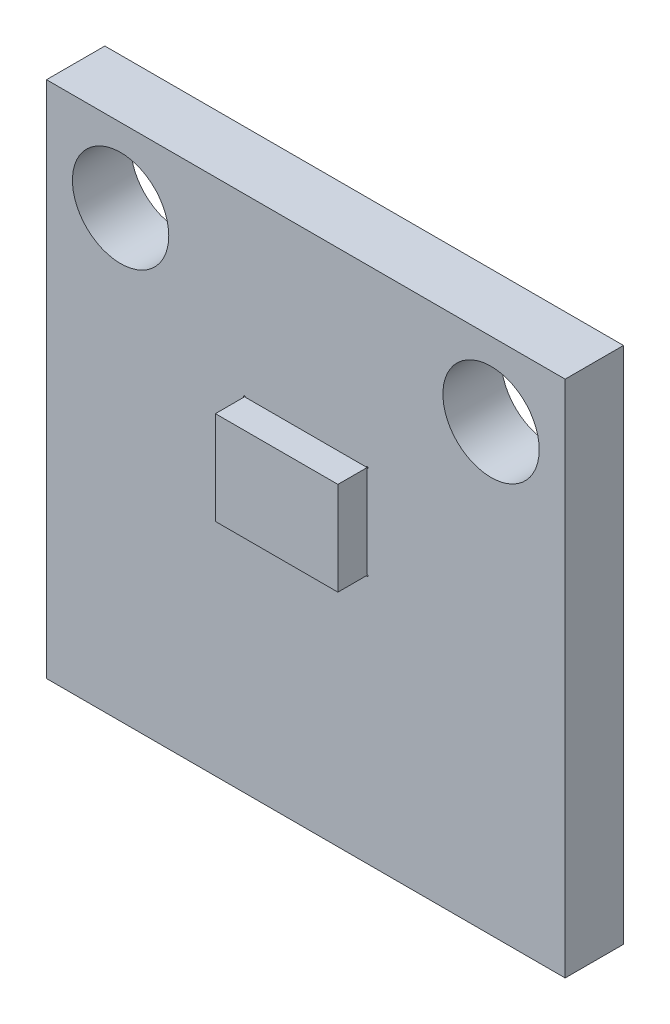
ISO-10303-21;
HEADER;
FILE_DESCRIPTION(('STEP AP214'),'2;1');
FILE_NAME('part.step','',(''),(''),'','','');
FILE_SCHEMA(('AUTOMOTIVE_DESIGN { 1 0 10303 214 1 1 1 1 }'));
ENDSEC;
DATA;
#1=APPLICATION_CONTEXT('core data for automotive mechanical design processes');
#2=APPLICATION_PROTOCOL_DEFINITION('international standard','automotive_design',2000,#1);
#3=PRODUCT_CONTEXT('',#1,'mechanical');
#4=PRODUCT('Part','Part','',(#3));
#5=PRODUCT_RELATED_PRODUCT_CATEGORY('part','',(#4));
#6=PRODUCT_DEFINITION_FORMATION('','',#4);
#7=PRODUCT_DEFINITION_CONTEXT('part definition',#1,'design');
#8=PRODUCT_DEFINITION('design','',#6,#7);
#9=PRODUCT_DEFINITION_SHAPE('','',#8);
#10=(LENGTH_UNIT() NAMED_UNIT(*) SI_UNIT(.MILLI.,.METRE.));
#11=(NAMED_UNIT(*) PLANE_ANGLE_UNIT() SI_UNIT($,.RADIAN.));
#12=(NAMED_UNIT(*) SI_UNIT($,.STERADIAN.) SOLID_ANGLE_UNIT());
#13=UNCERTAINTY_MEASURE_WITH_UNIT(LENGTH_MEASURE(1.E-05),#10,'distance_accuracy_value','');
#14=(GEOMETRIC_REPRESENTATION_CONTEXT(3) GLOBAL_UNCERTAINTY_ASSIGNED_CONTEXT((#13)) GLOBAL_UNIT_ASSIGNED_CONTEXT((#10,
#11,#12)) REPRESENTATION_CONTEXT('',''));
#15=CARTESIAN_POINT('',(0.,0.,0.));
#16=DIRECTION('',(0.,0.,1.));
#17=DIRECTION('',(1.,0.,0.));
#18=AXIS2_PLACEMENT_3D('',#15,#16,#17);
#19=CARTESIAN_POINT('',(0.,0.,2.));
#20=DIRECTION('',(0.,0.,1.));
#21=DIRECTION('',(1.,0.,0.));
#22=AXIS2_PLACEMENT_3D('',#19,#20,#21);
#23=PLANE('',#22);
#24=CARTESIAN_POINT('',(15.24,15.24,2.));
#25=DIRECTION('',(0.,0.,1.));
#26=DIRECTION('',(1.,0.,0.));
#27=AXIS2_PLACEMENT_3D('',#24,#25,#26);
#28=CIRCLE('',#27,1.651);
#29=CARTESIAN_POINT('',(16.891,15.24,2.));
#30=VERTEX_POINT('',#29);
#31=EDGE_CURVE('E308',#30,#30,#28,.T.);
#32=ORIENTED_EDGE('',*,*,#31,.F.);
#33=EDGE_LOOP('',(#32));
#34=FACE_BOUND('',#33,.T.);
#35=CARTESIAN_POINT('',(2.54,15.24,2.));
#36=DIRECTION('',(0.,0.,1.));
#37=DIRECTION('',(1.,0.,0.));
#38=AXIS2_PLACEMENT_3D('',#35,#36,#37);
#39=CIRCLE('',#38,1.651);
#40=CARTESIAN_POINT('',(4.191,15.24,2.));
#41=VERTEX_POINT('',#40);
#42=EDGE_CURVE('E302',#41,#41,#39,.T.);
#43=ORIENTED_EDGE('',*,*,#42,.F.);
#44=EDGE_LOOP('',(#43));
#45=FACE_BOUND('',#44,.T.);
#46=DIRECTION('',(-1.,0.,0.));
#47=VECTOR('',#46,1.);
#48=CARTESIAN_POINT('',(0.,0.,2.));
#49=LINE('',#48,#47);
#50=CARTESIAN_POINT('',(17.78,0.,2.));
#51=VERTEX_POINT('',#50);
#52=CARTESIAN_POINT('',(0.,0.,2.));
#53=VERTEX_POINT('',#52);
#54=EDGE_CURVE('E160',#51,#53,#49,.T.);
#55=ORIENTED_EDGE('',*,*,#54,.F.);
#56=DIRECTION('',(0.,-1.,0.));
#57=VECTOR('',#56,1.);
#58=CARTESIAN_POINT('',(17.78,0.,2.));
#59=LINE('',#58,#57);
#60=CARTESIAN_POINT('',(17.78,17.78,2.));
#61=VERTEX_POINT('',#60);
#62=EDGE_CURVE('E147',#61,#51,#59,.T.);
#63=ORIENTED_EDGE('',*,*,#62,.F.);
#64=DIRECTION('',(1.,0.,0.));
#65=VECTOR('',#64,1.);
#66=CARTESIAN_POINT('',(0.,17.78,2.));
#67=LINE('',#66,#65);
#68=CARTESIAN_POINT('',(0.,17.78,2.));
#69=VERTEX_POINT('',#68);
#70=EDGE_CURVE('E159',#69,#61,#67,.T.);
#71=ORIENTED_EDGE('',*,*,#70,.F.);
#72=DIRECTION('',(0.,1.,0.));
#73=VECTOR('',#72,1.);
#74=CARTESIAN_POINT('',(0.,0.,2.));
#75=LINE('',#74,#73);
#76=EDGE_CURVE('E163',#53,#69,#75,.T.);
#77=ORIENTED_EDGE('',*,*,#76,.F.);
#78=EDGE_LOOP('',(#55,#63,#71,#77));
#79=FACE_BOUND('',#78,.T.);
#80=CARTESIAN_POINT('',(10.9899958,8.5600032,2.));
#81=DIRECTION('',(0.,0.,1.));
#82=DIRECTION('',(1.,0.,0.));
#83=AXIS2_PLACEMENT_3D('',#80,#81,#82);
#84=CIRCLE('',#83,0.0317499999999997);
#85=CARTESIAN_POINT('',(10.9582458,8.5600032,2.));
#86=VERTEX_POINT('',#85);
#87=CARTESIAN_POINT('',(10.9899958,8.5917532,2.));
#88=VERTEX_POINT('',#87);
#89=EDGE_CURVE('E211',#86,#88,#84,.T.);
#90=ORIENTED_EDGE('',*,*,#89,.F.);
#91=DIRECTION('',(-1.,0.,0.));
#92=VECTOR('',#91,1.);
#93=CARTESIAN_POINT('',(0.,8.5600032,2.));
#94=LINE('',#93,#92);
#95=CARTESIAN_POINT('',(6.8217542,8.5600032,2.));
#96=VERTEX_POINT('',#95);
#97=EDGE_CURVE('E173',#86,#96,#94,.T.);
#98=ORIENTED_EDGE('',*,*,#97,.T.);
#99=CARTESIAN_POINT('',(6.7900042,8.5600032,2.));
#100=DIRECTION('',(0.,0.,1.));
#101=DIRECTION('',(1.,0.,0.));
#102=AXIS2_PLACEMENT_3D('',#99,#100,#101);
#103=CIRCLE('',#102,0.0317500000000001);
#104=CARTESIAN_POINT('',(6.7900042,8.5917532,2.));
#105=VERTEX_POINT('',#104);
#106=EDGE_CURVE('E319',#105,#96,#103,.T.);
#107=ORIENTED_EDGE('',*,*,#106,.F.);
#108=DIRECTION('',(0.,1.,0.));
#109=VECTOR('',#108,1.);
#110=CARTESIAN_POINT('',(6.7900042,0.,2.));
#111=LINE('',#110,#109);
#112=CARTESIAN_POINT('',(6.7900042,11.7282468,2.));
#113=VERTEX_POINT('',#112);
#114=EDGE_CURVE('E328',#105,#113,#111,.T.);
#115=ORIENTED_EDGE('',*,*,#114,.T.);
#116=CARTESIAN_POINT('',(6.7900042,11.7599968,2.));
#117=DIRECTION('',(0.,0.,1.));
#118=DIRECTION('',(1.,0.,0.));
#119=AXIS2_PLACEMENT_3D('',#116,#117,#118);
#120=CIRCLE('',#119,0.0317499999999997);
#121=CARTESIAN_POINT('',(6.8217542,11.7599968,2.));
#122=VERTEX_POINT('',#121);
#123=EDGE_CURVE('E316',#122,#113,#120,.T.);
#124=ORIENTED_EDGE('',*,*,#123,.F.);
#125=DIRECTION('',(1.,0.,0.));
#126=VECTOR('',#125,1.);
#127=CARTESIAN_POINT('',(0.,11.7599968,2.));
#128=LINE('',#127,#126);
#129=CARTESIAN_POINT('',(10.9582458,11.7599968,2.));
#130=VERTEX_POINT('',#129);
#131=EDGE_CURVE('E326',#122,#130,#128,.T.);
#132=ORIENTED_EDGE('',*,*,#131,.T.);
#133=CARTESIAN_POINT('',(10.9899958,11.7599968,2.));
#134=DIRECTION('',(0.,0.,1.));
#135=DIRECTION('',(1.,0.,0.));
#136=AXIS2_PLACEMENT_3D('',#133,#134,#135);
#137=CIRCLE('',#136,0.0317499999999997);
#138=CARTESIAN_POINT('',(10.9899958,11.7282468,2.));
#139=VERTEX_POINT('',#138);
#140=EDGE_CURVE('E311',#139,#130,#137,.T.);
#141=ORIENTED_EDGE('',*,*,#140,.F.);
#142=DIRECTION('',(0.,-1.,0.));
#143=VECTOR('',#142,1.);
#144=CARTESIAN_POINT('',(10.9899958,0.,2.));
#145=LINE('',#144,#143);
#146=EDGE_CURVE('E324',#139,#88,#145,.T.);
#147=ORIENTED_EDGE('',*,*,#146,.T.);
#148=EDGE_LOOP('',(#90,#98,#107,#115,#124,#132,#141,#147));
#149=FACE_BOUND('',#148,.T.);
#150=ADVANCED_FACE('F37',(#34,#45,#79,#149),#23,.T.);
#151=CARTESIAN_POINT('',(0.,0.,2.));
#152=DIRECTION('',(0.,-1.,0.));
#153=DIRECTION('',(1.,0.,0.));
#154=AXIS2_PLACEMENT_3D('',#151,#152,#153);
#155=PLANE('',#154);
#156=DIRECTION('',(-1.,0.,0.));
#157=VECTOR('',#156,1.);
#158=CARTESIAN_POINT('',(0.,0.,0.));
#159=LINE('',#158,#157);
#160=CARTESIAN_POINT('',(17.78,0.,0.));
#161=VERTEX_POINT('',#160);
#162=CARTESIAN_POINT('',(0.,0.,0.));
#163=VERTEX_POINT('',#162);
#164=EDGE_CURVE('E203',#161,#163,#159,.T.);
#165=ORIENTED_EDGE('',*,*,#164,.F.);
#166=DIRECTION('',(0.,0.,-1.));
#167=VECTOR('',#166,1.);
#168=CARTESIAN_POINT('',(17.78,0.,2.));
#169=LINE('',#168,#167);
#170=EDGE_CURVE('E11',#51,#161,#169,.T.);
#171=ORIENTED_EDGE('',*,*,#170,.F.);
#172=ORIENTED_EDGE('',*,*,#54,.T.);
#173=DIRECTION('',(0.,0.,-1.));
#174=VECTOR('',#173,1.);
#175=CARTESIAN_POINT('',(0.,0.,2.));
#176=LINE('',#175,#174);
#177=EDGE_CURVE('E56',#53,#163,#176,.T.);
#178=ORIENTED_EDGE('',*,*,#177,.T.);
#179=EDGE_LOOP('',(#165,#171,#172,#178));
#180=FACE_BOUND('',#179,.T.);
#181=ADVANCED_FACE('F270',(#180),#155,.T.);
#182=CARTESIAN_POINT('',(17.78,0.,2.));
#183=DIRECTION('',(1.,0.,0.));
#184=DIRECTION('',(0.,0.,-1.));
#185=AXIS2_PLACEMENT_3D('',#182,#183,#184);
#186=PLANE('',#185);
#187=DIRECTION('',(0.,-1.,0.));
#188=VECTOR('',#187,1.);
#189=CARTESIAN_POINT('',(17.78,0.,0.));
#190=LINE('',#189,#188);
#191=CARTESIAN_POINT('',(17.78,17.78,0.));
#192=VERTEX_POINT('',#191);
#193=EDGE_CURVE('E149',#192,#161,#190,.T.);
#194=ORIENTED_EDGE('',*,*,#193,.F.);
#195=DIRECTION('',(0.,0.,-1.));
#196=VECTOR('',#195,1.);
#197=CARTESIAN_POINT('',(17.78,17.78,2.));
#198=LINE('',#197,#196);
#199=EDGE_CURVE('E47',#61,#192,#198,.T.);
#200=ORIENTED_EDGE('',*,*,#199,.F.);
#201=ORIENTED_EDGE('',*,*,#62,.T.);
#202=ORIENTED_EDGE('',*,*,#170,.T.);
#203=EDGE_LOOP('',(#194,#200,#201,#202));
#204=FACE_BOUND('',#203,.T.);
#205=ADVANCED_FACE('F146',(#204),#186,.T.);
#206=CARTESIAN_POINT('',(0.,17.78,2.));
#207=DIRECTION('',(0.,1.,0.));
#208=DIRECTION('',(0.,0.,1.));
#209=AXIS2_PLACEMENT_3D('',#206,#207,#208);
#210=PLANE('',#209);
#211=DIRECTION('',(1.,0.,0.));
#212=VECTOR('',#211,1.);
#213=CARTESIAN_POINT('',(0.,17.78,0.));
#214=LINE('',#213,#212);
#215=CARTESIAN_POINT('',(0.,17.78,0.));
#216=VERTEX_POINT('',#215);
#217=EDGE_CURVE('E206',#216,#192,#214,.T.);
#218=ORIENTED_EDGE('',*,*,#217,.F.);
#219=DIRECTION('',(0.,0.,-1.));
#220=VECTOR('',#219,1.);
#221=CARTESIAN_POINT('',(0.,17.78,2.));
#222=LINE('',#221,#220);
#223=EDGE_CURVE('E106',#69,#216,#222,.T.);
#224=ORIENTED_EDGE('',*,*,#223,.F.);
#225=ORIENTED_EDGE('',*,*,#70,.T.);
#226=ORIENTED_EDGE('',*,*,#199,.T.);
#227=EDGE_LOOP('',(#218,#224,#225,#226));
#228=FACE_BOUND('',#227,.T.);
#229=ADVANCED_FACE('F162',(#228),#210,.T.);
#230=CARTESIAN_POINT('',(0.,11.7599968,2.));
#231=DIRECTION('',(0.,-1.,0.));
#232=DIRECTION('',(1.,0.,0.));
#233=AXIS2_PLACEMENT_3D('',#230,#231,#232);
#234=PLANE('',#233);
#235=DIRECTION('',(-1.,0.,0.));
#236=VECTOR('',#235,1.);
#237=CARTESIAN_POINT('',(0.,11.7599968,0.));
#238=LINE('',#237,#236);
#239=CARTESIAN_POINT('',(10.9899958,11.7599968,0.));
#240=VERTEX_POINT('',#239);
#241=CARTESIAN_POINT('',(10.9582458,11.7599968,0.));
#242=VERTEX_POINT('',#241);
#243=EDGE_CURVE('E193',#240,#242,#238,.T.);
#244=ORIENTED_EDGE('',*,*,#243,.T.);
#245=DIRECTION('',(0.,0.,-1.));
#246=VECTOR('',#245,1.);
#247=CARTESIAN_POINT('',(10.9582458,11.7599968,2.));
#248=LINE('',#247,#246);
#249=EDGE_CURVE('E213',#130,#242,#248,.T.);
#250=ORIENTED_EDGE('',*,*,#249,.F.);
#251=ORIENTED_EDGE('',*,*,#131,.F.);
#252=DIRECTION('',(0.,0.,-1.));
#253=VECTOR('',#252,1.);
#254=CARTESIAN_POINT('',(6.8217542,11.7599968,2.));
#255=LINE('',#254,#253);
#256=CARTESIAN_POINT('',(6.8217542,11.7599968,0.));
#257=VERTEX_POINT('',#256);
#258=EDGE_CURVE('E219',#122,#257,#255,.T.);
#259=ORIENTED_EDGE('',*,*,#258,.T.);
#260=CARTESIAN_POINT('',(6.7900042,11.7599968,0.));
#261=VERTEX_POINT('',#260);
#262=EDGE_CURVE('E190',#257,#261,#238,.T.);
#263=ORIENTED_EDGE('',*,*,#262,.T.);
#264=DIRECTION('',(0.,0.,-1.));
#265=VECTOR('',#264,1.);
#266=CARTESIAN_POINT('',(6.7900042,11.7599968,2.));
#267=LINE('',#266,#265);
#268=CARTESIAN_POINT('',(6.7900042,11.7599968,3.));
#269=VERTEX_POINT('',#268);
#270=EDGE_CURVE('E224',#269,#261,#267,.T.);
#271=ORIENTED_EDGE('',*,*,#270,.F.);
#272=DIRECTION('',(-1.,0.,0.));
#273=VECTOR('',#272,1.);
#274=CARTESIAN_POINT('',(0.,11.7599968,3.));
#275=LINE('',#274,#273);
#276=CARTESIAN_POINT('',(10.9899958,11.7599968,3.));
#277=VERTEX_POINT('',#276);
#278=EDGE_CURVE('E334',#277,#269,#275,.T.);
#279=ORIENTED_EDGE('',*,*,#278,.F.);
#280=DIRECTION('',(0.,0.,-1.));
#281=VECTOR('',#280,1.);
#282=CARTESIAN_POINT('',(10.9899958,11.7599968,2.));
#283=LINE('',#282,#281);
#284=EDGE_CURVE('E215',#277,#240,#283,.T.);
#285=ORIENTED_EDGE('',*,*,#284,.T.);
#286=EDGE_LOOP('',(#244,#250,#251,#259,#263,#271,#279,#285));
#287=FACE_BOUND('',#286,.T.);
#288=ADVANCED_FACE('F290',(#287),#234,.F.);
#289=CARTESIAN_POINT('',(10.9899958,11.7599968,2.));
#290=DIRECTION('',(0.,0.,-1.));
#291=DIRECTION('',(-1.,0.,0.));
#292=AXIS2_PLACEMENT_3D('',#289,#290,#291);
#293=CYLINDRICAL_SURFACE('',#292,0.0317499999999997);
#294=CARTESIAN_POINT('',(10.9899958,11.7599968,0.));
#295=DIRECTION('',(0.,0.,1.));
#296=DIRECTION('',(1.,0.,0.));
#297=AXIS2_PLACEMENT_3D('',#294,#295,#296);
#298=CIRCLE('',#297,0.0317499999999997);
#299=CARTESIAN_POINT('',(10.9899958,11.7282468,0.));
#300=VERTEX_POINT('',#299);
#301=EDGE_CURVE('E194',#300,#242,#298,.T.);
#302=ORIENTED_EDGE('',*,*,#301,.F.);
#303=DIRECTION('',(0.,0.,-1.));
#304=VECTOR('',#303,1.);
#305=CARTESIAN_POINT('',(10.9899958,11.7282468,2.));
#306=LINE('',#305,#304);
#307=EDGE_CURVE('E218',#139,#300,#306,.T.);
#308=ORIENTED_EDGE('',*,*,#307,.F.);
#309=ORIENTED_EDGE('',*,*,#140,.T.);
#310=ORIENTED_EDGE('',*,*,#249,.T.);
#311=EDGE_LOOP('',(#302,#308,#309,#310));
#312=FACE_BOUND('',#311,.T.);
#313=ADVANCED_FACE('F374',(#312),#293,.F.);
#314=CARTESIAN_POINT('',(6.7900042,11.7599968,2.));
#315=DIRECTION('',(0.,0.,-1.));
#316=DIRECTION('',(-1.,0.,0.));
#317=AXIS2_PLACEMENT_3D('',#314,#315,#316);
#318=CYLINDRICAL_SURFACE('',#317,0.0317499999999997);
#319=CARTESIAN_POINT('',(6.7900042,11.7599968,0.));
#320=DIRECTION('',(0.,0.,1.));
#321=DIRECTION('',(1.,0.,0.));
#322=AXIS2_PLACEMENT_3D('',#319,#320,#321);
#323=CIRCLE('',#322,0.0317499999999997);
#324=CARTESIAN_POINT('',(6.7900042,11.7282468,0.));
#325=VERTEX_POINT('',#324);
#326=EDGE_CURVE('E187',#257,#325,#323,.T.);
#327=ORIENTED_EDGE('',*,*,#326,.F.);
#328=ORIENTED_EDGE('',*,*,#258,.F.);
#329=ORIENTED_EDGE('',*,*,#123,.T.);
#330=DIRECTION('',(0.,0.,-1.));
#331=VECTOR('',#330,1.);
#332=CARTESIAN_POINT('',(6.7900042,11.7282468,2.));
#333=LINE('',#332,#331);
#334=EDGE_CURVE('E222',#113,#325,#333,.T.);
#335=ORIENTED_EDGE('',*,*,#334,.T.);
#336=EDGE_LOOP('',(#327,#328,#329,#335));
#337=FACE_BOUND('',#336,.T.);
#338=ADVANCED_FACE('F368',(#337),#318,.F.);
#339=CARTESIAN_POINT('',(6.7900042,8.5600032,2.));
#340=DIRECTION('',(0.,0.,-1.));
#341=DIRECTION('',(-1.,0.,0.));
#342=AXIS2_PLACEMENT_3D('',#339,#340,#341);
#343=CYLINDRICAL_SURFACE('',#342,0.0317500000000001);
#344=CARTESIAN_POINT('',(6.7900042,8.5600032,0.));
#345=DIRECTION('',(0.,0.,1.));
#346=DIRECTION('',(1.,0.,0.));
#347=AXIS2_PLACEMENT_3D('',#344,#345,#346);
#348=CIRCLE('',#347,0.0317500000000001);
#349=CARTESIAN_POINT('',(6.7900042,8.5917532,0.));
#350=VERTEX_POINT('',#349);
#351=CARTESIAN_POINT('',(6.8217542,8.5600032,0.));
#352=VERTEX_POINT('',#351);
#353=EDGE_CURVE('E179',#350,#352,#348,.T.);
#354=ORIENTED_EDGE('',*,*,#353,.F.);
#355=DIRECTION('',(0.,0.,-1.));
#356=VECTOR('',#355,1.);
#357=CARTESIAN_POINT('',(6.7900042,8.5917532,2.));
#358=LINE('',#357,#356);
#359=EDGE_CURVE('E225',#105,#350,#358,.T.);
#360=ORIENTED_EDGE('',*,*,#359,.F.);
#361=ORIENTED_EDGE('',*,*,#106,.T.);
#362=DIRECTION('',(0.,0.,-1.));
#363=VECTOR('',#362,1.);
#364=CARTESIAN_POINT('',(6.8217542,8.5600032,2.));
#365=LINE('',#364,#363);
#366=EDGE_CURVE('E229',#96,#352,#365,.T.);
#367=ORIENTED_EDGE('',*,*,#366,.T.);
#368=EDGE_LOOP('',(#354,#360,#361,#367));
#369=FACE_BOUND('',#368,.T.);
#370=ADVANCED_FACE('F298',(#369),#343,.F.);
#371=CARTESIAN_POINT('',(10.9899958,8.5600032,2.));
#372=DIRECTION('',(0.,0.,-1.));
#373=DIRECTION('',(-1.,0.,0.));
#374=AXIS2_PLACEMENT_3D('',#371,#372,#373);
#375=CYLINDRICAL_SURFACE('',#374,0.0317499999999997);
#376=CARTESIAN_POINT('',(10.9899958,8.5600032,0.));
#377=DIRECTION('',(0.,0.,1.));
#378=DIRECTION('',(1.,0.,0.));
#379=AXIS2_PLACEMENT_3D('',#376,#377,#378);
#380=CIRCLE('',#379,0.0317499999999997);
#381=CARTESIAN_POINT('',(10.9582458,8.5600032,0.));
#382=VERTEX_POINT('',#381);
#383=CARTESIAN_POINT('',(10.9899958,8.5917532,0.));
#384=VERTEX_POINT('',#383);
#385=EDGE_CURVE('E169',#382,#384,#380,.T.);
#386=ORIENTED_EDGE('',*,*,#385,.F.);
#387=DIRECTION('',(0.,0.,-1.));
#388=VECTOR('',#387,1.);
#389=CARTESIAN_POINT('',(10.9582458,8.5600032,2.));
#390=LINE('',#389,#388);
#391=EDGE_CURVE('E41',#86,#382,#390,.T.);
#392=ORIENTED_EDGE('',*,*,#391,.F.);
#393=ORIENTED_EDGE('',*,*,#89,.T.);
#394=DIRECTION('',(0.,0.,-1.));
#395=VECTOR('',#394,1.);
#396=CARTESIAN_POINT('',(10.9899958,8.5917532,2.));
#397=LINE('',#396,#395);
#398=EDGE_CURVE('E165',#88,#384,#397,.T.);
#399=ORIENTED_EDGE('',*,*,#398,.T.);
#400=EDGE_LOOP('',(#386,#392,#393,#399));
#401=FACE_BOUND('',#400,.T.);
#402=ADVANCED_FACE('F39',(#401),#375,.F.);
#403=CARTESIAN_POINT('',(2.54,15.24,2.));
#404=DIRECTION('',(0.,0.,-1.));
#405=DIRECTION('',(-1.,0.,0.));
#406=AXIS2_PLACEMENT_3D('',#403,#404,#405);
#407=CYLINDRICAL_SURFACE('',#406,1.651);
#408=ORIENTED_EDGE('',*,*,#42,.T.);
#409=EDGE_LOOP('',(#408));
#410=FACE_BOUND('',#409,.T.);
#411=CARTESIAN_POINT('',(2.54,15.24,0.));
#412=DIRECTION('',(0.,0.,1.));
#413=DIRECTION('',(1.,0.,0.));
#414=AXIS2_PLACEMENT_3D('',#411,#412,#413);
#415=CIRCLE('',#414,1.651);
#416=CARTESIAN_POINT('',(4.191,15.24,0.));
#417=VERTEX_POINT('',#416);
#418=EDGE_CURVE('E200',#417,#417,#415,.T.);
#419=ORIENTED_EDGE('',*,*,#418,.F.);
#420=EDGE_LOOP('',(#419));
#421=FACE_BOUND('',#420,.T.);
#422=ADVANCED_FACE('F265',(#410,#421),#407,.F.);
#423=CARTESIAN_POINT('',(15.24,15.24,2.));
#424=DIRECTION('',(0.,0.,-1.));
#425=DIRECTION('',(-1.,0.,0.));
#426=AXIS2_PLACEMENT_3D('',#423,#424,#425);
#427=CYLINDRICAL_SURFACE('',#426,1.651);
#428=ORIENTED_EDGE('',*,*,#31,.T.);
#429=EDGE_LOOP('',(#428));
#430=FACE_BOUND('',#429,.T.);
#431=CARTESIAN_POINT('',(15.24,15.24,0.));
#432=DIRECTION('',(0.,0.,1.));
#433=DIRECTION('',(1.,0.,0.));
#434=AXIS2_PLACEMENT_3D('',#431,#432,#433);
#435=CIRCLE('',#434,1.651);
#436=CARTESIAN_POINT('',(16.891,15.24,0.));
#437=VERTEX_POINT('',#436);
#438=EDGE_CURVE('E197',#437,#437,#435,.T.);
#439=ORIENTED_EDGE('',*,*,#438,.F.);
#440=EDGE_LOOP('',(#439));
#441=FACE_BOUND('',#440,.T.);
#442=ADVANCED_FACE('F257',(#430,#441),#427,.F.);
#443=CARTESIAN_POINT('',(10.9899958,0.,2.));
#444=DIRECTION('',(-1.,0.,0.));
#445=DIRECTION('',(0.,0.,1.));
#446=AXIS2_PLACEMENT_3D('',#443,#444,#445);
#447=PLANE('',#446);
#448=DIRECTION('',(0.,1.,0.));
#449=VECTOR('',#448,1.);
#450=CARTESIAN_POINT('',(10.9899958,0.,0.));
#451=LINE('',#450,#449);
#452=EDGE_CURVE('E180',#300,#240,#451,.T.);
#453=ORIENTED_EDGE('',*,*,#452,.T.);
#454=ORIENTED_EDGE('',*,*,#284,.F.);
#455=DIRECTION('',(0.,1.,0.));
#456=VECTOR('',#455,1.);
#457=CARTESIAN_POINT('',(10.9899958,0.,3.));
#458=LINE('',#457,#456);
#459=CARTESIAN_POINT('',(10.9899958,8.5600032,3.));
#460=VERTEX_POINT('',#459);
#461=EDGE_CURVE('E337',#460,#277,#458,.T.);
#462=ORIENTED_EDGE('',*,*,#461,.F.);
#463=DIRECTION('',(0.,0.,-1.));
#464=VECTOR('',#463,1.);
#465=CARTESIAN_POINT('',(10.9899958,8.5600032,2.));
#466=LINE('',#465,#464);
#467=CARTESIAN_POINT('',(10.9899958,8.5600032,0.));
#468=VERTEX_POINT('',#467);
#469=EDGE_CURVE('E235',#460,#468,#466,.T.);
#470=ORIENTED_EDGE('',*,*,#469,.T.);
#471=EDGE_CURVE('E175',#468,#384,#451,.T.);
#472=ORIENTED_EDGE('',*,*,#471,.T.);
#473=ORIENTED_EDGE('',*,*,#398,.F.);
#474=ORIENTED_EDGE('',*,*,#146,.F.);
#475=ORIENTED_EDGE('',*,*,#307,.T.);
#476=EDGE_LOOP('',(#453,#454,#462,#470,#472,#473,#474,#475));
#477=FACE_BOUND('',#476,.T.);
#478=ADVANCED_FACE('F252',(#477),#447,.F.);
#479=CARTESIAN_POINT('',(6.7900042,0.,2.));
#480=DIRECTION('',(1.,0.,0.));
#481=DIRECTION('',(0.,1.,0.));
#482=AXIS2_PLACEMENT_3D('',#479,#480,#481);
#483=PLANE('',#482);
#484=DIRECTION('',(0.,-1.,0.));
#485=VECTOR('',#484,1.);
#486=CARTESIAN_POINT('',(6.7900042,0.,0.));
#487=LINE('',#486,#485);
#488=EDGE_CURVE('E186',#261,#325,#487,.T.);
#489=ORIENTED_EDGE('',*,*,#488,.T.);
#490=ORIENTED_EDGE('',*,*,#334,.F.);
#491=ORIENTED_EDGE('',*,*,#114,.F.);
#492=ORIENTED_EDGE('',*,*,#359,.T.);
#493=CARTESIAN_POINT('',(6.7900042,8.5600032,0.));
#494=VERTEX_POINT('',#493);
#495=EDGE_CURVE('E183',#350,#494,#487,.T.);
#496=ORIENTED_EDGE('',*,*,#495,.T.);
#497=DIRECTION('',(0.,0.,-1.));
#498=VECTOR('',#497,1.);
#499=CARTESIAN_POINT('',(6.7900042,8.5600032,2.));
#500=LINE('',#499,#498);
#501=CARTESIAN_POINT('',(6.7900042,8.5600032,3.));
#502=VERTEX_POINT('',#501);
#503=EDGE_CURVE('E231',#502,#494,#500,.T.);
#504=ORIENTED_EDGE('',*,*,#503,.F.);
#505=DIRECTION('',(0.,-1.,0.));
#506=VECTOR('',#505,1.);
#507=CARTESIAN_POINT('',(6.7900042,0.,3.));
#508=LINE('',#507,#506);
#509=EDGE_CURVE('E331',#269,#502,#508,.T.);
#510=ORIENTED_EDGE('',*,*,#509,.F.);
#511=ORIENTED_EDGE('',*,*,#270,.T.);
#512=EDGE_LOOP('',(#489,#490,#491,#492,#496,#504,#510,#511));
#513=FACE_BOUND('',#512,.T.);
#514=ADVANCED_FACE('F256',(#513),#483,.F.);
#515=CARTESIAN_POINT('',(0.,8.5600032,2.));
#516=DIRECTION('',(0.,1.,0.));
#517=DIRECTION('',(0.,0.,1.));
#518=AXIS2_PLACEMENT_3D('',#515,#516,#517);
#519=PLANE('',#518);
#520=DIRECTION('',(1.,0.,0.));
#521=VECTOR('',#520,1.);
#522=CARTESIAN_POINT('',(0.,8.5600032,0.));
#523=LINE('',#522,#521);
#524=EDGE_CURVE('E176',#494,#352,#523,.T.);
#525=ORIENTED_EDGE('',*,*,#524,.T.);
#526=ORIENTED_EDGE('',*,*,#366,.F.);
#527=ORIENTED_EDGE('',*,*,#97,.F.);
#528=ORIENTED_EDGE('',*,*,#391,.T.);
#529=EDGE_CURVE('E172',#382,#468,#523,.T.);
#530=ORIENTED_EDGE('',*,*,#529,.T.);
#531=ORIENTED_EDGE('',*,*,#469,.F.);
#532=DIRECTION('',(1.,0.,0.));
#533=VECTOR('',#532,1.);
#534=CARTESIAN_POINT('',(0.,8.5600032,3.));
#535=LINE('',#534,#533);
#536=EDGE_CURVE('E340',#502,#460,#535,.T.);
#537=ORIENTED_EDGE('',*,*,#536,.F.);
#538=ORIENTED_EDGE('',*,*,#503,.T.);
#539=EDGE_LOOP('',(#525,#526,#527,#528,#530,#531,#537,#538));
#540=FACE_BOUND('',#539,.T.);
#541=ADVANCED_FACE('F245',(#540),#519,.F.);
#542=CARTESIAN_POINT('',(0.,0.,2.));
#543=DIRECTION('',(-1.,0.,0.));
#544=DIRECTION('',(0.,0.,1.));
#545=AXIS2_PLACEMENT_3D('',#542,#543,#544);
#546=PLANE('',#545);
#547=DIRECTION('',(0.,1.,0.));
#548=VECTOR('',#547,1.);
#549=CARTESIAN_POINT('',(0.,0.,0.));
#550=LINE('',#549,#548);
#551=EDGE_CURVE('E208',#163,#216,#550,.T.);
#552=ORIENTED_EDGE('',*,*,#551,.F.);
#553=ORIENTED_EDGE('',*,*,#177,.F.);
#554=ORIENTED_EDGE('',*,*,#76,.T.);
#555=ORIENTED_EDGE('',*,*,#223,.T.);
#556=EDGE_LOOP('',(#552,#553,#554,#555));
#557=FACE_BOUND('',#556,.T.);
#558=ADVANCED_FACE('F284',(#557),#546,.T.);
#559=CARTESIAN_POINT('',(0.,0.,0.));
#560=DIRECTION('',(0.,0.,1.));
#561=DIRECTION('',(1.,0.,0.));
#562=AXIS2_PLACEMENT_3D('',#559,#560,#561);
#563=PLANE('',#562);
#564=ORIENTED_EDGE('',*,*,#353,.T.);
#565=ORIENTED_EDGE('',*,*,#524,.F.);
#566=ORIENTED_EDGE('',*,*,#495,.F.);
#567=EDGE_LOOP('',(#564,#565,#566));
#568=FACE_BOUND('',#567,.T.);
#569=ORIENTED_EDGE('',*,*,#385,.T.);
#570=ORIENTED_EDGE('',*,*,#471,.F.);
#571=ORIENTED_EDGE('',*,*,#529,.F.);
#572=EDGE_LOOP('',(#569,#570,#571));
#573=FACE_BOUND('',#572,.T.);
#574=ORIENTED_EDGE('',*,*,#301,.T.);
#575=ORIENTED_EDGE('',*,*,#243,.F.);
#576=ORIENTED_EDGE('',*,*,#452,.F.);
#577=EDGE_LOOP('',(#574,#575,#576));
#578=FACE_BOUND('',#577,.T.);
#579=ORIENTED_EDGE('',*,*,#262,.F.);
#580=ORIENTED_EDGE('',*,*,#326,.T.);
#581=ORIENTED_EDGE('',*,*,#488,.F.);
#582=EDGE_LOOP('',(#579,#580,#581));
#583=FACE_BOUND('',#582,.T.);
#584=ORIENTED_EDGE('',*,*,#164,.T.);
#585=ORIENTED_EDGE('',*,*,#551,.T.);
#586=ORIENTED_EDGE('',*,*,#217,.T.);
#587=ORIENTED_EDGE('',*,*,#193,.T.);
#588=EDGE_LOOP('',(#584,#585,#586,#587));
#589=FACE_BOUND('',#588,.T.);
#590=ORIENTED_EDGE('',*,*,#418,.T.);
#591=EDGE_LOOP('',(#590));
#592=FACE_BOUND('',#591,.T.);
#593=ORIENTED_EDGE('',*,*,#438,.T.);
#594=EDGE_LOOP('',(#593));
#595=FACE_BOUND('',#594,.T.);
#596=ADVANCED_FACE('F248',(#568,#573,#578,#583,#589,#592,#595),#563,.F.);
#597=CARTESIAN_POINT('',(0.,0.,3.));
#598=DIRECTION('',(0.,0.,1.));
#599=DIRECTION('',(1.,0.,0.));
#600=AXIS2_PLACEMENT_3D('',#597,#598,#599);
#601=PLANE('',#600);
#602=ORIENTED_EDGE('',*,*,#536,.T.);
#603=ORIENTED_EDGE('',*,*,#461,.T.);
#604=ORIENTED_EDGE('',*,*,#278,.T.);
#605=ORIENTED_EDGE('',*,*,#509,.T.);
#606=EDGE_LOOP('',(#602,#603,#604,#605));
#607=FACE_BOUND('',#606,.T.);
#608=ADVANCED_FACE('F281',(#607),#601,.T.);
#609=CLOSED_SHELL('',(#150,#181,#205,#229,#288,#313,#338,#370,#402,#422,#442,#478,#514,#541,
#558,#596,#608));
#610=MANIFOLD_SOLID_BREP('B2',#609);
#611=ADVANCED_BREP_SHAPE_REPRESENTATION('',(#18,#610),#14);
#612=SHAPE_DEFINITION_REPRESENTATION(#9,#611);
ENDSEC;
END-ISO-10303-21;
